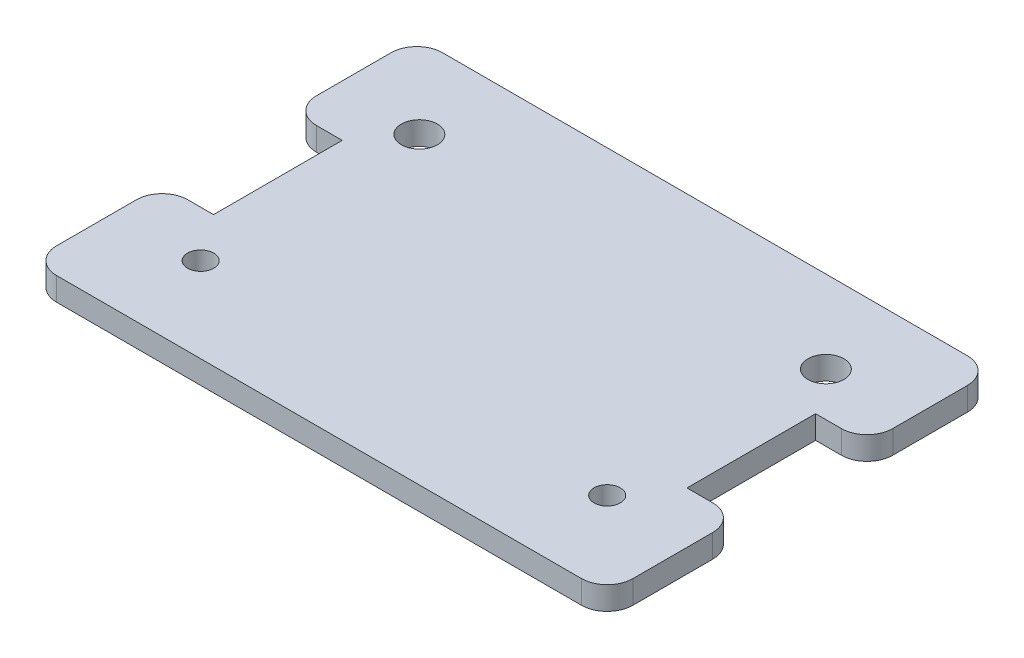
ISO-10303-21;
HEADER;
FILE_DESCRIPTION(('STEP AP214'),'2;1');
FILE_NAME('part.step','',(''),(''),'','','');
FILE_SCHEMA(('AUTOMOTIVE_DESIGN { 1 0 10303 214 1 1 1 1 }'));
ENDSEC;
DATA;
#1=APPLICATION_CONTEXT('core data for automotive mechanical design processes');
#2=APPLICATION_PROTOCOL_DEFINITION('international standard','automotive_design',2000,#1);
#3=PRODUCT_CONTEXT('',#1,'mechanical');
#4=PRODUCT('Part','Part','',(#3));
#5=PRODUCT_RELATED_PRODUCT_CATEGORY('part','',(#4));
#6=PRODUCT_DEFINITION_FORMATION('','',#4);
#7=PRODUCT_DEFINITION_CONTEXT('part definition',#1,'design');
#8=PRODUCT_DEFINITION('design','',#6,#7);
#9=PRODUCT_DEFINITION_SHAPE('','',#8);
#10=(LENGTH_UNIT() NAMED_UNIT(*) SI_UNIT(.MILLI.,.METRE.));
#11=(NAMED_UNIT(*) PLANE_ANGLE_UNIT() SI_UNIT($,.RADIAN.));
#12=(NAMED_UNIT(*) SI_UNIT($,.STERADIAN.) SOLID_ANGLE_UNIT());
#13=UNCERTAINTY_MEASURE_WITH_UNIT(LENGTH_MEASURE(1.E-05),#10,'distance_accuracy_value','');
#14=(GEOMETRIC_REPRESENTATION_CONTEXT(3) GLOBAL_UNCERTAINTY_ASSIGNED_CONTEXT((#13)) GLOBAL_UNIT_ASSIGNED_CONTEXT((#10,
#11,#12)) REPRESENTATION_CONTEXT('',''));
#15=CARTESIAN_POINT('',(0.,0.,0.));
#16=DIRECTION('',(0.,0.,1.));
#17=DIRECTION('',(1.,0.,0.));
#18=AXIS2_PLACEMENT_3D('',#15,#16,#17);
#19=CARTESIAN_POINT('',(0.,4.5,0.));
#20=DIRECTION('',(1.,0.,0.));
#21=DIRECTION('',(0.,0.,-1.));
#22=AXIS2_PLACEMENT_3D('',#19,#20,#21);
#23=PLANE('',#22);
#24=DIRECTION('',(0.,0.,1.));
#25=VECTOR('',#24,1.);
#26=CARTESIAN_POINT('',(0.,0.,0.));
#27=LINE('',#26,#25);
#28=CARTESIAN_POINT('',(0.,0.,-70.));
#29=VERTEX_POINT('',#28);
#30=CARTESIAN_POINT('',(0.,0.,-55.5));
#31=VERTEX_POINT('',#30);
#32=EDGE_CURVE('E262',#29,#31,#27,.T.);
#33=ORIENTED_EDGE('',*,*,#32,.T.);
#34=DIRECTION('',(0.,1.,0.));
#35=VECTOR('',#34,1.);
#36=CARTESIAN_POINT('',(0.,4.5,-55.5));
#37=LINE('',#36,#35);
#38=CARTESIAN_POINT('',(0.,4.5,-55.5));
#39=VERTEX_POINT('',#38);
#40=EDGE_CURVE('E40',#31,#39,#37,.T.);
#41=ORIENTED_EDGE('',*,*,#40,.T.);
#42=DIRECTION('',(0.,0.,1.));
#43=VECTOR('',#42,1.);
#44=CARTESIAN_POINT('',(0.,4.5,0.));
#45=LINE('',#44,#43);
#46=CARTESIAN_POINT('',(0.,4.5,-70.));
#47=VERTEX_POINT('',#46);
#48=EDGE_CURVE('E249',#47,#39,#45,.T.);
#49=ORIENTED_EDGE('',*,*,#48,.F.);
#50=DIRECTION('',(0.,-1.,0.));
#51=VECTOR('',#50,1.);
#52=CARTESIAN_POINT('',(0.,4.5,-70.));
#53=LINE('',#52,#51);
#54=EDGE_CURVE('E335',#47,#29,#53,.T.);
#55=ORIENTED_EDGE('',*,*,#54,.T.);
#56=EDGE_LOOP('',(#33,#41,#49,#55));
#57=FACE_BOUND('',#56,.T.);
#58=ADVANCED_FACE('F32',(#57),#23,.F.);
#59=CARTESIAN_POINT('',(112.,4.5,0.));
#60=DIRECTION('',(-1.,0.,0.));
#61=DIRECTION('',(0.,0.,1.));
#62=AXIS2_PLACEMENT_3D('',#59,#60,#61);
#63=PLANE('',#62);
#64=DIRECTION('',(0.,0.,-1.));
#65=VECTOR('',#64,1.);
#66=CARTESIAN_POINT('',(112.,4.5,0.));
#67=LINE('',#66,#65);
#68=CARTESIAN_POINT('',(112.,4.5,-5.));
#69=VERTEX_POINT('',#68);
#70=CARTESIAN_POINT('',(112.,4.5,-20.5));
#71=VERTEX_POINT('',#70);
#72=EDGE_CURVE('E257',#69,#71,#67,.T.);
#73=ORIENTED_EDGE('',*,*,#72,.F.);
#74=DIRECTION('',(0.,-1.,0.));
#75=VECTOR('',#74,1.);
#76=CARTESIAN_POINT('',(112.,4.5,-5.));
#77=LINE('',#76,#75);
#78=CARTESIAN_POINT('',(112.,0.,-5.));
#79=VERTEX_POINT('',#78);
#80=EDGE_CURVE('E276',#69,#79,#77,.T.);
#81=ORIENTED_EDGE('',*,*,#80,.T.);
#82=DIRECTION('',(0.,0.,-1.));
#83=VECTOR('',#82,1.);
#84=CARTESIAN_POINT('',(112.,0.,0.));
#85=LINE('',#84,#83);
#86=CARTESIAN_POINT('',(112.,0.,-20.5));
#87=VERTEX_POINT('',#86);
#88=EDGE_CURVE('E271',#79,#87,#85,.T.);
#89=ORIENTED_EDGE('',*,*,#88,.T.);
#90=DIRECTION('',(0.,1.,0.));
#91=VECTOR('',#90,1.);
#92=CARTESIAN_POINT('',(112.,4.5,-20.5));
#93=LINE('',#92,#91);
#94=EDGE_CURVE('E261',#87,#71,#93,.T.);
#95=ORIENTED_EDGE('',*,*,#94,.T.);
#96=EDGE_LOOP('',(#73,#81,#89,#95));
#97=FACE_BOUND('',#96,.T.);
#98=ADVANCED_FACE('F362',(#97),#63,.F.);
#99=CARTESIAN_POINT('',(0.,0.,-20.5));
#100=VERTEX_POINT('',#99);
#101=CARTESIAN_POINT('',(0.,0.,-5.));
#102=VERTEX_POINT('',#101);
#103=EDGE_CURVE('E244',#100,#102,#27,.T.);
#104=ORIENTED_EDGE('',*,*,#103,.T.);
#105=DIRECTION('',(0.,-1.,0.));
#106=VECTOR('',#105,1.);
#107=CARTESIAN_POINT('',(0.,4.5,-5.));
#108=LINE('',#107,#106);
#109=CARTESIAN_POINT('',(0.,4.5,-5.));
#110=VERTEX_POINT('',#109);
#111=EDGE_CURVE('E47',#102,#110,#108,.F.);
#112=ORIENTED_EDGE('',*,*,#111,.T.);
#113=CARTESIAN_POINT('',(0.,4.5,-20.5));
#114=VERTEX_POINT('',#113);
#115=EDGE_CURVE('E247',#114,#110,#45,.T.);
#116=ORIENTED_EDGE('',*,*,#115,.F.);
#117=DIRECTION('',(0.,1.,0.));
#118=VECTOR('',#117,1.);
#119=CARTESIAN_POINT('',(0.,4.5,-20.5));
#120=LINE('',#119,#118);
#121=EDGE_CURVE('E329',#114,#100,#120,.F.);
#122=ORIENTED_EDGE('',*,*,#121,.T.);
#123=EDGE_LOOP('',(#104,#112,#116,#122));
#124=FACE_BOUND('',#123,.T.);
#125=ADVANCED_FACE('F364',(#124),#23,.F.);
#126=CARTESIAN_POINT('',(0.,4.5,0.));
#127=DIRECTION('',(0.,0.,-1.));
#128=DIRECTION('',(-1.,0.,0.));
#129=AXIS2_PLACEMENT_3D('',#126,#127,#128);
#130=PLANE('',#129);
#131=DIRECTION('',(1.,0.,0.));
#132=VECTOR('',#131,1.);
#133=CARTESIAN_POINT('',(0.,0.,0.));
#134=LINE('',#133,#132);
#135=CARTESIAN_POINT('',(5.,0.,0.));
#136=VERTEX_POINT('',#135);
#137=CARTESIAN_POINT('',(107.,0.,0.));
#138=VERTEX_POINT('',#137);
#139=EDGE_CURVE('E265',#136,#138,#134,.T.);
#140=ORIENTED_EDGE('',*,*,#139,.T.);
#141=DIRECTION('',(0.,-1.,0.));
#142=VECTOR('',#141,1.);
#143=CARTESIAN_POINT('',(107.,4.5,0.));
#144=LINE('',#143,#142);
#145=CARTESIAN_POINT('',(107.,4.5,0.));
#146=VERTEX_POINT('',#145);
#147=EDGE_CURVE('E298',#138,#146,#144,.F.);
#148=ORIENTED_EDGE('',*,*,#147,.T.);
#149=DIRECTION('',(1.,0.,0.));
#150=VECTOR('',#149,1.);
#151=CARTESIAN_POINT('',(0.,4.5,0.));
#152=LINE('',#151,#150);
#153=CARTESIAN_POINT('',(5.,4.5,0.));
#154=VERTEX_POINT('',#153);
#155=EDGE_CURVE('E251',#154,#146,#152,.T.);
#156=ORIENTED_EDGE('',*,*,#155,.F.);
#157=DIRECTION('',(0.,-1.,0.));
#158=VECTOR('',#157,1.);
#159=CARTESIAN_POINT('',(5.,4.5,0.));
#160=LINE('',#159,#158);
#161=EDGE_CURVE('E295',#154,#136,#160,.T.);
#162=ORIENTED_EDGE('',*,*,#161,.T.);
#163=EDGE_LOOP('',(#140,#148,#156,#162));
#164=FACE_BOUND('',#163,.T.);
#165=ADVANCED_FACE('F375',(#164),#130,.F.);
#166=CARTESIAN_POINT('',(112.,4.5,-55.5));
#167=VERTEX_POINT('',#166);
#168=CARTESIAN_POINT('',(112.,4.5,-70.));
#169=VERTEX_POINT('',#168);
#170=EDGE_CURVE('E254',#167,#169,#67,.T.);
#171=ORIENTED_EDGE('',*,*,#170,.F.);
#172=DIRECTION('',(0.,1.,0.));
#173=VECTOR('',#172,1.);
#174=CARTESIAN_POINT('',(112.,4.5,-55.5));
#175=LINE('',#174,#173);
#176=CARTESIAN_POINT('',(112.,0.,-55.5));
#177=VERTEX_POINT('',#176);
#178=EDGE_CURVE('E322',#167,#177,#175,.F.);
#179=ORIENTED_EDGE('',*,*,#178,.T.);
#180=CARTESIAN_POINT('',(112.,0.,-70.));
#181=VERTEX_POINT('',#180);
#182=EDGE_CURVE('E268',#177,#181,#85,.T.);
#183=ORIENTED_EDGE('',*,*,#182,.T.);
#184=DIRECTION('',(0.,-1.,0.));
#185=VECTOR('',#184,1.);
#186=CARTESIAN_POINT('',(112.,4.5,-70.));
#187=LINE('',#186,#185);
#188=EDGE_CURVE('E320',#181,#169,#187,.F.);
#189=ORIENTED_EDGE('',*,*,#188,.T.);
#190=EDGE_LOOP('',(#171,#179,#183,#189));
#191=FACE_BOUND('',#190,.T.);
#192=ADVANCED_FACE('F371',(#191),#63,.F.);
#193=CARTESIAN_POINT('',(0.,4.5,-75.));
#194=DIRECTION('',(0.,0.,1.));
#195=DIRECTION('',(1.,0.,0.));
#196=AXIS2_PLACEMENT_3D('',#193,#194,#195);
#197=PLANE('',#196);
#198=DIRECTION('',(-1.,0.,0.));
#199=VECTOR('',#198,1.);
#200=CARTESIAN_POINT('',(0.,4.5,-75.));
#201=LINE('',#200,#199);
#202=CARTESIAN_POINT('',(107.,4.5,-75.));
#203=VERTEX_POINT('',#202);
#204=CARTESIAN_POINT('',(5.,4.5,-75.));
#205=VERTEX_POINT('',#204);
#206=EDGE_CURVE('E258',#203,#205,#201,.T.);
#207=ORIENTED_EDGE('',*,*,#206,.F.);
#208=DIRECTION('',(0.,-1.,0.));
#209=VECTOR('',#208,1.);
#210=CARTESIAN_POINT('',(107.,4.5,-75.));
#211=LINE('',#210,#209);
#212=CARTESIAN_POINT('',(107.,0.,-75.));
#213=VERTEX_POINT('',#212);
#214=EDGE_CURVE('E326',#203,#213,#211,.T.);
#215=ORIENTED_EDGE('',*,*,#214,.T.);
#216=DIRECTION('',(-1.,0.,0.));
#217=VECTOR('',#216,1.);
#218=CARTESIAN_POINT('',(0.,0.,-75.));
#219=LINE('',#218,#217);
#220=CARTESIAN_POINT('',(5.,0.,-75.));
#221=VERTEX_POINT('',#220);
#222=EDGE_CURVE('E250',#213,#221,#219,.T.);
#223=ORIENTED_EDGE('',*,*,#222,.T.);
#224=DIRECTION('',(0.,-1.,0.));
#225=VECTOR('',#224,1.);
#226=CARTESIAN_POINT('',(5.,4.5,-75.));
#227=LINE('',#226,#225);
#228=EDGE_CURVE('E324',#221,#205,#227,.F.);
#229=ORIENTED_EDGE('',*,*,#228,.T.);
#230=EDGE_LOOP('',(#207,#215,#223,#229));
#231=FACE_BOUND('',#230,.T.);
#232=ADVANCED_FACE('F428',(#231),#197,.F.);
#233=CARTESIAN_POINT('',(0.,4.5,0.));
#234=DIRECTION('',(0.,-1.,0.));
#235=DIRECTION('',(0.,0.,-1.));
#236=AXIS2_PLACEMENT_3D('',#233,#234,#235);
#237=PLANE('',#236);
#238=CARTESIAN_POINT('',(16.5,4.5,-16.5));
#239=DIRECTION('',(0.,1.,0.));
#240=DIRECTION('',(0.,0.,1.));
#241=AXIS2_PLACEMENT_3D('',#238,#239,#240);
#242=CIRCLE('',#241,2.55);
#243=CARTESIAN_POINT('',(16.5,4.5,-13.95));
#244=VERTEX_POINT('',#243);
#245=EDGE_CURVE('E211',#244,#244,#242,.T.);
#246=ORIENTED_EDGE('',*,*,#245,.F.);
#247=EDGE_LOOP('',(#246));
#248=FACE_BOUND('',#247,.T.);
#249=CARTESIAN_POINT('',(16.5,4.5,-59.));
#250=DIRECTION('',(0.,1.,0.));
#251=DIRECTION('',(0.,0.,1.));
#252=AXIS2_PLACEMENT_3D('',#249,#250,#251);
#253=CIRCLE('',#252,3.5);
#254=CARTESIAN_POINT('',(16.5,4.5,-55.5));
#255=VERTEX_POINT('',#254);
#256=EDGE_CURVE('E217',#255,#255,#253,.T.);
#257=ORIENTED_EDGE('',*,*,#256,.F.);
#258=EDGE_LOOP('',(#257));
#259=FACE_BOUND('',#258,.T.);
#260=CARTESIAN_POINT('',(95.5,4.5,-59.));
#261=DIRECTION('',(0.,1.,0.));
#262=DIRECTION('',(0.,0.,1.));
#263=AXIS2_PLACEMENT_3D('',#260,#261,#262);
#264=CIRCLE('',#263,3.50000000000001);
#265=CARTESIAN_POINT('',(95.5,4.5,-55.5));
#266=VERTEX_POINT('',#265);
#267=EDGE_CURVE('E181',#266,#266,#264,.T.);
#268=ORIENTED_EDGE('',*,*,#267,.F.);
#269=EDGE_LOOP('',(#268));
#270=FACE_BOUND('',#269,.T.);
#271=CARTESIAN_POINT('',(95.5,4.5,-16.5));
#272=DIRECTION('',(0.,1.,0.));
#273=DIRECTION('',(0.,0.,1.));
#274=AXIS2_PLACEMENT_3D('',#271,#272,#273);
#275=CIRCLE('',#274,2.54999999999999);
#276=CARTESIAN_POINT('',(95.5,4.5,-13.95));
#277=VERTEX_POINT('',#276);
#278=EDGE_CURVE('E210',#277,#277,#275,.T.);
#279=ORIENTED_EDGE('',*,*,#278,.F.);
#280=EDGE_LOOP('',(#279));
#281=FACE_BOUND('',#280,.T.);
#282=ORIENTED_EDGE('',*,*,#155,.T.);
#283=CARTESIAN_POINT('',(107.,4.5,-5.));
#284=DIRECTION('',(0.,-1.,0.));
#285=DIRECTION('',(0.,0.,-1.));
#286=AXIS2_PLACEMENT_3D('',#283,#284,#285);
#287=CIRCLE('',#286,5.);
#288=EDGE_CURVE('E313',#146,#69,#287,.F.);
#289=ORIENTED_EDGE('',*,*,#288,.T.);
#290=ORIENTED_EDGE('',*,*,#72,.T.);
#291=CARTESIAN_POINT('',(107.,4.5,-20.5));
#292=DIRECTION('',(0.,-1.,0.));
#293=DIRECTION('',(0.,0.,-1.));
#294=AXIS2_PLACEMENT_3D('',#291,#292,#293);
#295=CIRCLE('',#294,5.);
#296=CARTESIAN_POINT('',(107.,4.5,-25.5));
#297=VERTEX_POINT('',#296);
#298=EDGE_CURVE('E311',#71,#297,#295,.F.);
#299=ORIENTED_EDGE('',*,*,#298,.T.);
#300=DIRECTION('',(1.,0.,0.));
#301=VECTOR('',#300,1.);
#302=CARTESIAN_POINT('',(112.,4.5,-25.5));
#303=LINE('',#302,#301);
#304=CARTESIAN_POINT('',(102.,4.5,-25.5));
#305=VERTEX_POINT('',#304);
#306=EDGE_CURVE('E224',#305,#297,#303,.T.);
#307=ORIENTED_EDGE('',*,*,#306,.F.);
#308=DIRECTION('',(0.,0.,1.));
#309=VECTOR('',#308,1.);
#310=CARTESIAN_POINT('',(102.,4.5,-25.5));
#311=LINE('',#310,#309);
#312=CARTESIAN_POINT('',(102.,4.5,-50.5));
#313=VERTEX_POINT('',#312);
#314=EDGE_CURVE('E233',#313,#305,#311,.T.);
#315=ORIENTED_EDGE('',*,*,#314,.F.);
#316=DIRECTION('',(-1.,0.,0.));
#317=VECTOR('',#316,1.);
#318=CARTESIAN_POINT('',(112.,4.5,-50.5));
#319=LINE('',#318,#317);
#320=CARTESIAN_POINT('',(107.,4.5,-50.5));
#321=VERTEX_POINT('',#320);
#322=EDGE_CURVE('E231',#321,#313,#319,.T.);
#323=ORIENTED_EDGE('',*,*,#322,.F.);
#324=CARTESIAN_POINT('',(107.,4.5,-55.5));
#325=DIRECTION('',(0.,-1.,0.));
#326=DIRECTION('',(0.,0.,-1.));
#327=AXIS2_PLACEMENT_3D('',#324,#325,#326);
#328=CIRCLE('',#327,5.);
#329=EDGE_CURVE('E309',#321,#167,#328,.F.);
#330=ORIENTED_EDGE('',*,*,#329,.T.);
#331=ORIENTED_EDGE('',*,*,#170,.T.);
#332=CARTESIAN_POINT('',(107.,4.5,-70.));
#333=DIRECTION('',(0.,-1.,0.));
#334=DIRECTION('',(0.,0.,-1.));
#335=AXIS2_PLACEMENT_3D('',#332,#333,#334);
#336=CIRCLE('',#335,5.);
#337=EDGE_CURVE('E307',#169,#203,#336,.F.);
#338=ORIENTED_EDGE('',*,*,#337,.T.);
#339=ORIENTED_EDGE('',*,*,#206,.T.);
#340=CARTESIAN_POINT('',(5.,4.5,-70.));
#341=DIRECTION('',(0.,-1.,0.));
#342=DIRECTION('',(0.,0.,-1.));
#343=AXIS2_PLACEMENT_3D('',#340,#341,#342);
#344=CIRCLE('',#343,5.);
#345=EDGE_CURVE('E300',#205,#47,#344,.F.);
#346=ORIENTED_EDGE('',*,*,#345,.T.);
#347=ORIENTED_EDGE('',*,*,#48,.T.);
#348=CARTESIAN_POINT('',(5.,4.5,-55.5));
#349=DIRECTION('',(0.,-1.,0.));
#350=DIRECTION('',(0.,0.,-1.));
#351=AXIS2_PLACEMENT_3D('',#348,#349,#350);
#352=CIRCLE('',#351,5.);
#353=CARTESIAN_POINT('',(5.,4.5,-50.5));
#354=VERTEX_POINT('',#353);
#355=EDGE_CURVE('E302',#39,#354,#352,.F.);
#356=ORIENTED_EDGE('',*,*,#355,.T.);
#357=DIRECTION('',(-1.,0.,0.));
#358=VECTOR('',#357,1.);
#359=CARTESIAN_POINT('',(0.,4.5,-50.5));
#360=LINE('',#359,#358);
#361=CARTESIAN_POINT('',(10.,4.5,-50.5));
#362=VERTEX_POINT('',#361);
#363=EDGE_CURVE('E197',#362,#354,#360,.T.);
#364=ORIENTED_EDGE('',*,*,#363,.F.);
#365=DIRECTION('',(0.,0.,-1.));
#366=VECTOR('',#365,1.);
#367=CARTESIAN_POINT('',(10.,4.5,-25.5));
#368=LINE('',#367,#366);
#369=CARTESIAN_POINT('',(10.,4.5,-25.5));
#370=VERTEX_POINT('',#369);
#371=EDGE_CURVE('E177',#370,#362,#368,.T.);
#372=ORIENTED_EDGE('',*,*,#371,.F.);
#373=DIRECTION('',(1.,0.,0.));
#374=VECTOR('',#373,1.);
#375=CARTESIAN_POINT('',(0.,4.5,-25.5));
#376=LINE('',#375,#374);
#377=CARTESIAN_POINT('',(5.,4.5,-25.5));
#378=VERTEX_POINT('',#377);
#379=EDGE_CURVE('E201',#378,#370,#376,.T.);
#380=ORIENTED_EDGE('',*,*,#379,.F.);
#381=CARTESIAN_POINT('',(5.,4.5,-20.5));
#382=DIRECTION('',(0.,-1.,0.));
#383=DIRECTION('',(0.,0.,-1.));
#384=AXIS2_PLACEMENT_3D('',#381,#382,#383);
#385=CIRCLE('',#384,5.);
#386=EDGE_CURVE('E54',#378,#114,#385,.F.);
#387=ORIENTED_EDGE('',*,*,#386,.T.);
#388=ORIENTED_EDGE('',*,*,#115,.T.);
#389=CARTESIAN_POINT('',(5.,4.5,-5.));
#390=DIRECTION('',(0.,-1.,0.));
#391=DIRECTION('',(0.,0.,-1.));
#392=AXIS2_PLACEMENT_3D('',#389,#390,#391);
#393=CIRCLE('',#392,5.);
#394=EDGE_CURVE('E305',#110,#154,#393,.F.);
#395=ORIENTED_EDGE('',*,*,#394,.T.);
#396=EDGE_LOOP('',(#282,#289,#290,#299,#307,#315,#323,#330,#331,#338,#339,#346,#347,#356,#364,
#372,#380,#387,#388,#395));
#397=FACE_BOUND('',#396,.T.);
#398=ADVANCED_FACE('F345',(#248,#259,#270,#281,#397),#237,.F.);
#399=CARTESIAN_POINT('',(0.,0.,0.));
#400=DIRECTION('',(0.,-1.,0.));
#401=DIRECTION('',(0.,0.,-1.));
#402=AXIS2_PLACEMENT_3D('',#399,#400,#401);
#403=PLANE('',#402);
#404=ORIENTED_EDGE('',*,*,#88,.F.);
#405=CARTESIAN_POINT('',(107.,0.,-5.));
#406=DIRECTION('',(0.,-1.,0.));
#407=DIRECTION('',(0.,0.,-1.));
#408=AXIS2_PLACEMENT_3D('',#405,#406,#407);
#409=CIRCLE('',#408,5.);
#410=EDGE_CURVE('E293',#79,#138,#409,.T.);
#411=ORIENTED_EDGE('',*,*,#410,.T.);
#412=ORIENTED_EDGE('',*,*,#139,.F.);
#413=CARTESIAN_POINT('',(5.,0.,-5.));
#414=DIRECTION('',(0.,-1.,0.));
#415=DIRECTION('',(0.,0.,-1.));
#416=AXIS2_PLACEMENT_3D('',#413,#414,#415);
#417=CIRCLE('',#416,5.);
#418=EDGE_CURVE('E285',#136,#102,#417,.T.);
#419=ORIENTED_EDGE('',*,*,#418,.T.);
#420=ORIENTED_EDGE('',*,*,#103,.F.);
#421=CARTESIAN_POINT('',(5.,0.,-20.5));
#422=DIRECTION('',(0.,-1.,0.));
#423=DIRECTION('',(0.,0.,-1.));
#424=AXIS2_PLACEMENT_3D('',#421,#422,#423);
#425=CIRCLE('',#424,5.);
#426=CARTESIAN_POINT('',(5.,0.,-25.5));
#427=VERTEX_POINT('',#426);
#428=EDGE_CURVE('E283',#100,#427,#425,.T.);
#429=ORIENTED_EDGE('',*,*,#428,.T.);
#430=DIRECTION('',(1.,0.,0.));
#431=VECTOR('',#430,1.);
#432=CARTESIAN_POINT('',(0.,0.,-25.5));
#433=LINE('',#432,#431);
#434=CARTESIAN_POINT('',(10.,0.,-25.5));
#435=VERTEX_POINT('',#434);
#436=EDGE_CURVE('E195',#427,#435,#433,.T.);
#437=ORIENTED_EDGE('',*,*,#436,.T.);
#438=DIRECTION('',(0.,0.,-1.));
#439=VECTOR('',#438,1.);
#440=CARTESIAN_POINT('',(10.,0.,-25.5));
#441=LINE('',#440,#439);
#442=CARTESIAN_POINT('',(10.,0.,-50.5));
#443=VERTEX_POINT('',#442);
#444=EDGE_CURVE('E174',#435,#443,#441,.T.);
#445=ORIENTED_EDGE('',*,*,#444,.T.);
#446=DIRECTION('',(-1.,0.,0.));
#447=VECTOR('',#446,1.);
#448=CARTESIAN_POINT('',(0.,0.,-50.5));
#449=LINE('',#448,#447);
#450=CARTESIAN_POINT('',(5.,0.,-50.5));
#451=VERTEX_POINT('',#450);
#452=EDGE_CURVE('E185',#443,#451,#449,.T.);
#453=ORIENTED_EDGE('',*,*,#452,.T.);
#454=CARTESIAN_POINT('',(5.,0.,-55.5));
#455=DIRECTION('',(0.,-1.,0.));
#456=DIRECTION('',(0.,0.,-1.));
#457=AXIS2_PLACEMENT_3D('',#454,#455,#456);
#458=CIRCLE('',#457,5.);
#459=EDGE_CURVE('E281',#451,#31,#458,.T.);
#460=ORIENTED_EDGE('',*,*,#459,.T.);
#461=ORIENTED_EDGE('',*,*,#32,.F.);
#462=CARTESIAN_POINT('',(5.,0.,-70.));
#463=DIRECTION('',(0.,-1.,0.));
#464=DIRECTION('',(0.,0.,-1.));
#465=AXIS2_PLACEMENT_3D('',#462,#463,#464);
#466=CIRCLE('',#465,5.);
#467=EDGE_CURVE('E279',#29,#221,#466,.T.);
#468=ORIENTED_EDGE('',*,*,#467,.T.);
#469=ORIENTED_EDGE('',*,*,#222,.F.);
#470=CARTESIAN_POINT('',(107.,0.,-70.));
#471=DIRECTION('',(0.,-1.,0.));
#472=DIRECTION('',(0.,0.,-1.));
#473=AXIS2_PLACEMENT_3D('',#470,#471,#472);
#474=CIRCLE('',#473,5.);
#475=EDGE_CURVE('E287',#213,#181,#474,.T.);
#476=ORIENTED_EDGE('',*,*,#475,.T.);
#477=ORIENTED_EDGE('',*,*,#182,.F.);
#478=CARTESIAN_POINT('',(107.,0.,-55.5));
#479=DIRECTION('',(0.,-1.,0.));
#480=DIRECTION('',(0.,0.,-1.));
#481=AXIS2_PLACEMENT_3D('',#478,#479,#480);
#482=CIRCLE('',#481,5.);
#483=CARTESIAN_POINT('',(107.,0.,-50.5));
#484=VERTEX_POINT('',#483);
#485=EDGE_CURVE('E289',#177,#484,#482,.T.);
#486=ORIENTED_EDGE('',*,*,#485,.T.);
#487=DIRECTION('',(-1.,0.,0.));
#488=VECTOR('',#487,1.);
#489=CARTESIAN_POINT('',(112.,0.,-50.5));
#490=LINE('',#489,#488);
#491=CARTESIAN_POINT('',(102.,0.,-50.5));
#492=VERTEX_POINT('',#491);
#493=EDGE_CURVE('E221',#484,#492,#490,.T.);
#494=ORIENTED_EDGE('',*,*,#493,.T.);
#495=DIRECTION('',(0.,0.,1.));
#496=VECTOR('',#495,1.);
#497=CARTESIAN_POINT('',(102.,0.,-25.5));
#498=LINE('',#497,#496);
#499=CARTESIAN_POINT('',(102.,0.,-25.5));
#500=VERTEX_POINT('',#499);
#501=EDGE_CURVE('E223',#492,#500,#498,.T.);
#502=ORIENTED_EDGE('',*,*,#501,.T.);
#503=DIRECTION('',(1.,0.,0.));
#504=VECTOR('',#503,1.);
#505=CARTESIAN_POINT('',(112.,0.,-25.5));
#506=LINE('',#505,#504);
#507=CARTESIAN_POINT('',(107.,0.,-25.5));
#508=VERTEX_POINT('',#507);
#509=EDGE_CURVE('E227',#500,#508,#506,.T.);
#510=ORIENTED_EDGE('',*,*,#509,.T.);
#511=CARTESIAN_POINT('',(107.,0.,-20.5));
#512=DIRECTION('',(0.,-1.,0.));
#513=DIRECTION('',(0.,0.,-1.));
#514=AXIS2_PLACEMENT_3D('',#511,#512,#513);
#515=CIRCLE('',#514,5.);
#516=EDGE_CURVE('E291',#508,#87,#515,.T.);
#517=ORIENTED_EDGE('',*,*,#516,.T.);
#518=EDGE_LOOP('',(#404,#411,#412,#419,#420,#429,#437,#445,#453,#460,#461,#468,#469,#476,#477,
#486,#494,#502,#510,#517));
#519=FACE_BOUND('',#518,.T.);
#520=CARTESIAN_POINT('',(16.5,0.,-16.5));
#521=DIRECTION('',(0.,1.,0.));
#522=DIRECTION('',(0.,0.,1.));
#523=AXIS2_PLACEMENT_3D('',#520,#521,#522);
#524=CIRCLE('',#523,2.55);
#525=CARTESIAN_POINT('',(16.5,0.,-13.95));
#526=VERTEX_POINT('',#525);
#527=EDGE_CURVE('E207',#526,#526,#524,.T.);
#528=ORIENTED_EDGE('',*,*,#527,.T.);
#529=EDGE_LOOP('',(#528));
#530=FACE_BOUND('',#529,.T.);
#531=CARTESIAN_POINT('',(16.5,0.,-59.));
#532=DIRECTION('',(0.,1.,0.));
#533=DIRECTION('',(0.,0.,1.));
#534=AXIS2_PLACEMENT_3D('',#531,#532,#533);
#535=CIRCLE('',#534,3.5);
#536=CARTESIAN_POINT('',(16.5,0.,-55.5));
#537=VERTEX_POINT('',#536);
#538=EDGE_CURVE('E214',#537,#537,#535,.T.);
#539=ORIENTED_EDGE('',*,*,#538,.T.);
#540=EDGE_LOOP('',(#539));
#541=FACE_BOUND('',#540,.T.);
#542=CARTESIAN_POINT('',(95.5,0.,-59.));
#543=DIRECTION('',(0.,1.,0.));
#544=DIRECTION('',(0.,0.,1.));
#545=AXIS2_PLACEMENT_3D('',#542,#543,#544);
#546=CIRCLE('',#545,3.50000000000001);
#547=CARTESIAN_POINT('',(95.5,0.,-55.5));
#548=VERTEX_POINT('',#547);
#549=EDGE_CURVE('E220',#548,#548,#546,.T.);
#550=ORIENTED_EDGE('',*,*,#549,.T.);
#551=EDGE_LOOP('',(#550));
#552=FACE_BOUND('',#551,.T.);
#553=CARTESIAN_POINT('',(95.5,0.,-16.5));
#554=DIRECTION('',(0.,1.,0.));
#555=DIRECTION('',(0.,0.,1.));
#556=AXIS2_PLACEMENT_3D('',#553,#554,#555);
#557=CIRCLE('',#556,2.54999999999999);
#558=CARTESIAN_POINT('',(95.5,0.,-13.95));
#559=VERTEX_POINT('',#558);
#560=EDGE_CURVE('E241',#559,#559,#557,.T.);
#561=ORIENTED_EDGE('',*,*,#560,.T.);
#562=EDGE_LOOP('',(#561));
#563=FACE_BOUND('',#562,.T.);
#564=ADVANCED_FACE('F192',(#519,#530,#541,#552,#563),#403,.T.);
#565=CARTESIAN_POINT('',(95.5,0.,-16.5));
#566=DIRECTION('',(0.,1.,0.));
#567=DIRECTION('',(0.,0.,1.));
#568=AXIS2_PLACEMENT_3D('',#565,#566,#567);
#569=CYLINDRICAL_SURFACE('',#568,2.54999999999999);
#570=ORIENTED_EDGE('',*,*,#560,.F.);
#571=EDGE_LOOP('',(#570));
#572=FACE_BOUND('',#571,.T.);
#573=ORIENTED_EDGE('',*,*,#278,.T.);
#574=EDGE_LOOP('',(#573));
#575=FACE_BOUND('',#574,.T.);
#576=ADVANCED_FACE('F439',(#572,#575),#569,.F.);
#577=CARTESIAN_POINT('',(0.,0.,-50.5));
#578=DIRECTION('',(0.,0.,-1.));
#579=DIRECTION('',(-1.,0.,0.));
#580=AXIS2_PLACEMENT_3D('',#577,#578,#579);
#581=PLANE('',#580);
#582=ORIENTED_EDGE('',*,*,#363,.T.);
#583=DIRECTION('',(0.,1.,0.));
#584=VECTOR('',#583,1.);
#585=CARTESIAN_POINT('',(5.,0.,-50.5));
#586=LINE('',#585,#584);
#587=EDGE_CURVE('E11',#354,#451,#586,.F.);
#588=ORIENTED_EDGE('',*,*,#587,.T.);
#589=ORIENTED_EDGE('',*,*,#452,.F.);
#590=DIRECTION('',(0.,1.,0.));
#591=VECTOR('',#590,1.);
#592=CARTESIAN_POINT('',(10.,0.,-50.5));
#593=LINE('',#592,#591);
#594=EDGE_CURVE('E169',#443,#362,#593,.T.);
#595=ORIENTED_EDGE('',*,*,#594,.T.);
#596=EDGE_LOOP('',(#582,#588,#589,#595));
#597=FACE_BOUND('',#596,.T.);
#598=ADVANCED_FACE('F186',(#597),#581,.F.);
#599=CARTESIAN_POINT('',(10.,0.,-25.5));
#600=DIRECTION('',(1.,0.,0.));
#601=DIRECTION('',(0.,0.,-1.));
#602=AXIS2_PLACEMENT_3D('',#599,#600,#601);
#603=PLANE('',#602);
#604=ORIENTED_EDGE('',*,*,#371,.T.);
#605=ORIENTED_EDGE('',*,*,#594,.F.);
#606=ORIENTED_EDGE('',*,*,#444,.F.);
#607=DIRECTION('',(0.,1.,0.));
#608=VECTOR('',#607,1.);
#609=CARTESIAN_POINT('',(10.,0.,-25.5));
#610=LINE('',#609,#608);
#611=EDGE_CURVE('E182',#435,#370,#610,.T.);
#612=ORIENTED_EDGE('',*,*,#611,.T.);
#613=EDGE_LOOP('',(#604,#605,#606,#612));
#614=FACE_BOUND('',#613,.T.);
#615=ADVANCED_FACE('F171',(#614),#603,.F.);
#616=CARTESIAN_POINT('',(0.,0.,-25.5));
#617=DIRECTION('',(0.,0.,1.));
#618=DIRECTION('',(1.,0.,0.));
#619=AXIS2_PLACEMENT_3D('',#616,#617,#618);
#620=PLANE('',#619);
#621=ORIENTED_EDGE('',*,*,#436,.F.);
#622=DIRECTION('',(0.,1.,0.));
#623=VECTOR('',#622,1.);
#624=CARTESIAN_POINT('',(5.,0.,-25.5));
#625=LINE('',#624,#623);
#626=EDGE_CURVE('E332',#427,#378,#625,.T.);
#627=ORIENTED_EDGE('',*,*,#626,.T.);
#628=ORIENTED_EDGE('',*,*,#379,.T.);
#629=ORIENTED_EDGE('',*,*,#611,.F.);
#630=EDGE_LOOP('',(#621,#627,#628,#629));
#631=FACE_BOUND('',#630,.T.);
#632=ADVANCED_FACE('F459',(#631),#620,.F.);
#633=CARTESIAN_POINT('',(95.5,0.,-59.));
#634=DIRECTION('',(0.,1.,0.));
#635=DIRECTION('',(0.,0.,1.));
#636=AXIS2_PLACEMENT_3D('',#633,#634,#635);
#637=CYLINDRICAL_SURFACE('',#636,3.50000000000001);
#638=ORIENTED_EDGE('',*,*,#549,.F.);
#639=EDGE_LOOP('',(#638));
#640=FACE_BOUND('',#639,.T.);
#641=ORIENTED_EDGE('',*,*,#267,.T.);
#642=EDGE_LOOP('',(#641));
#643=FACE_BOUND('',#642,.T.);
#644=ADVANCED_FACE('F454',(#640,#643),#637,.F.);
#645=CARTESIAN_POINT('',(16.5,0.,-59.));
#646=DIRECTION('',(0.,1.,0.));
#647=DIRECTION('',(0.,0.,1.));
#648=AXIS2_PLACEMENT_3D('',#645,#646,#647);
#649=CYLINDRICAL_SURFACE('',#648,3.5);
#650=ORIENTED_EDGE('',*,*,#538,.F.);
#651=EDGE_LOOP('',(#650));
#652=FACE_BOUND('',#651,.T.);
#653=ORIENTED_EDGE('',*,*,#256,.T.);
#654=EDGE_LOOP('',(#653));
#655=FACE_BOUND('',#654,.T.);
#656=ADVANCED_FACE('F451',(#652,#655),#649,.F.);
#657=CARTESIAN_POINT('',(16.5,0.,-16.5));
#658=DIRECTION('',(0.,1.,0.));
#659=DIRECTION('',(0.,0.,1.));
#660=AXIS2_PLACEMENT_3D('',#657,#658,#659);
#661=CYLINDRICAL_SURFACE('',#660,2.55);
#662=ORIENTED_EDGE('',*,*,#527,.F.);
#663=EDGE_LOOP('',(#662));
#664=FACE_BOUND('',#663,.T.);
#665=ORIENTED_EDGE('',*,*,#245,.T.);
#666=EDGE_LOOP('',(#665));
#667=FACE_BOUND('',#666,.T.);
#668=ADVANCED_FACE('F450',(#664,#667),#661,.F.);
#669=CARTESIAN_POINT('',(112.,0.,-25.5));
#670=DIRECTION('',(0.,0.,1.));
#671=DIRECTION('',(1.,0.,0.));
#672=AXIS2_PLACEMENT_3D('',#669,#670,#671);
#673=PLANE('',#672);
#674=ORIENTED_EDGE('',*,*,#306,.T.);
#675=DIRECTION('',(0.,1.,0.));
#676=VECTOR('',#675,1.);
#677=CARTESIAN_POINT('',(107.,0.,-25.5));
#678=LINE('',#677,#676);
#679=EDGE_CURVE('E315',#297,#508,#678,.F.);
#680=ORIENTED_EDGE('',*,*,#679,.T.);
#681=ORIENTED_EDGE('',*,*,#509,.F.);
#682=DIRECTION('',(0.,1.,0.));
#683=VECTOR('',#682,1.);
#684=CARTESIAN_POINT('',(102.,0.,-25.5));
#685=LINE('',#684,#683);
#686=EDGE_CURVE('E203',#500,#305,#685,.T.);
#687=ORIENTED_EDGE('',*,*,#686,.T.);
#688=EDGE_LOOP('',(#674,#680,#681,#687));
#689=FACE_BOUND('',#688,.T.);
#690=ADVANCED_FACE('F404',(#689),#673,.F.);
#691=CARTESIAN_POINT('',(102.,0.,-25.5));
#692=DIRECTION('',(-1.,0.,0.));
#693=DIRECTION('',(0.,0.,1.));
#694=AXIS2_PLACEMENT_3D('',#691,#692,#693);
#695=PLANE('',#694);
#696=ORIENTED_EDGE('',*,*,#314,.T.);
#697=ORIENTED_EDGE('',*,*,#686,.F.);
#698=ORIENTED_EDGE('',*,*,#501,.F.);
#699=DIRECTION('',(0.,1.,0.));
#700=VECTOR('',#699,1.);
#701=CARTESIAN_POINT('',(102.,0.,-50.5));
#702=LINE('',#701,#700);
#703=EDGE_CURVE('E230',#492,#313,#702,.T.);
#704=ORIENTED_EDGE('',*,*,#703,.T.);
#705=EDGE_LOOP('',(#696,#697,#698,#704));
#706=FACE_BOUND('',#705,.T.);
#707=ADVANCED_FACE('F408',(#706),#695,.F.);
#708=CARTESIAN_POINT('',(112.,0.,-50.5));
#709=DIRECTION('',(0.,0.,-1.));
#710=DIRECTION('',(-1.,0.,0.));
#711=AXIS2_PLACEMENT_3D('',#708,#709,#710);
#712=PLANE('',#711);
#713=ORIENTED_EDGE('',*,*,#493,.F.);
#714=DIRECTION('',(0.,1.,0.));
#715=VECTOR('',#714,1.);
#716=CARTESIAN_POINT('',(107.,0.,-50.5));
#717=LINE('',#716,#715);
#718=EDGE_CURVE('E317',#484,#321,#717,.T.);
#719=ORIENTED_EDGE('',*,*,#718,.T.);
#720=ORIENTED_EDGE('',*,*,#322,.T.);
#721=ORIENTED_EDGE('',*,*,#703,.F.);
#722=EDGE_LOOP('',(#713,#719,#720,#721));
#723=FACE_BOUND('',#722,.T.);
#724=ADVANCED_FACE('F414',(#723),#712,.F.);
#725=CARTESIAN_POINT('',(107.,4.5,-5.));
#726=DIRECTION('',(0.,-1.,0.));
#727=DIRECTION('',(0.,0.,-1.));
#728=AXIS2_PLACEMENT_3D('',#725,#726,#727);
#729=CYLINDRICAL_SURFACE('',#728,5.);
#730=ORIENTED_EDGE('',*,*,#288,.F.);
#731=ORIENTED_EDGE('',*,*,#147,.F.);
#732=ORIENTED_EDGE('',*,*,#410,.F.);
#733=ORIENTED_EDGE('',*,*,#80,.F.);
#734=EDGE_LOOP('',(#730,#731,#732,#733));
#735=FACE_BOUND('',#734,.T.);
#736=ADVANCED_FACE('F391',(#735),#729,.T.);
#737=CARTESIAN_POINT('',(107.,4.5,-20.5));
#738=DIRECTION('',(0.,1.,0.));
#739=DIRECTION('',(0.,0.,1.));
#740=AXIS2_PLACEMENT_3D('',#737,#738,#739);
#741=CYLINDRICAL_SURFACE('',#740,5.);
#742=ORIENTED_EDGE('',*,*,#516,.F.);
#743=ORIENTED_EDGE('',*,*,#679,.F.);
#744=ORIENTED_EDGE('',*,*,#298,.F.);
#745=ORIENTED_EDGE('',*,*,#94,.F.);
#746=EDGE_LOOP('',(#742,#743,#744,#745));
#747=FACE_BOUND('',#746,.T.);
#748=ADVANCED_FACE('F399',(#747),#741,.T.);
#749=CARTESIAN_POINT('',(107.,0.,-55.5));
#750=DIRECTION('',(0.,1.,0.));
#751=DIRECTION('',(0.,0.,1.));
#752=AXIS2_PLACEMENT_3D('',#749,#750,#751);
#753=CYLINDRICAL_SURFACE('',#752,5.);
#754=ORIENTED_EDGE('',*,*,#485,.F.);
#755=ORIENTED_EDGE('',*,*,#178,.F.);
#756=ORIENTED_EDGE('',*,*,#329,.F.);
#757=ORIENTED_EDGE('',*,*,#718,.F.);
#758=EDGE_LOOP('',(#754,#755,#756,#757));
#759=FACE_BOUND('',#758,.T.);
#760=ADVANCED_FACE('F418',(#759),#753,.T.);
#761=CARTESIAN_POINT('',(107.,4.5,-70.));
#762=DIRECTION('',(0.,-1.,0.));
#763=DIRECTION('',(0.,0.,-1.));
#764=AXIS2_PLACEMENT_3D('',#761,#762,#763);
#765=CYLINDRICAL_SURFACE('',#764,5.);
#766=ORIENTED_EDGE('',*,*,#337,.F.);
#767=ORIENTED_EDGE('',*,*,#188,.F.);
#768=ORIENTED_EDGE('',*,*,#475,.F.);
#769=ORIENTED_EDGE('',*,*,#214,.F.);
#770=EDGE_LOOP('',(#766,#767,#768,#769));
#771=FACE_BOUND('',#770,.T.);
#772=ADVANCED_FACE('F426',(#771),#765,.T.);
#773=CARTESIAN_POINT('',(5.,4.5,-5.));
#774=DIRECTION('',(0.,-1.,0.));
#775=DIRECTION('',(0.,0.,-1.));
#776=AXIS2_PLACEMENT_3D('',#773,#774,#775);
#777=CYLINDRICAL_SURFACE('',#776,5.);
#778=ORIENTED_EDGE('',*,*,#394,.F.);
#779=ORIENTED_EDGE('',*,*,#111,.F.);
#780=ORIENTED_EDGE('',*,*,#418,.F.);
#781=ORIENTED_EDGE('',*,*,#161,.F.);
#782=EDGE_LOOP('',(#778,#779,#780,#781));
#783=FACE_BOUND('',#782,.T.);
#784=ADVANCED_FACE('F358',(#783),#777,.T.);
#785=CARTESIAN_POINT('',(5.,0.,-20.5));
#786=DIRECTION('',(0.,1.,0.));
#787=DIRECTION('',(0.,0.,1.));
#788=AXIS2_PLACEMENT_3D('',#785,#786,#787);
#789=CYLINDRICAL_SURFACE('',#788,5.);
#790=ORIENTED_EDGE('',*,*,#428,.F.);
#791=ORIENTED_EDGE('',*,*,#121,.F.);
#792=ORIENTED_EDGE('',*,*,#386,.F.);
#793=ORIENTED_EDGE('',*,*,#626,.F.);
#794=EDGE_LOOP('',(#790,#791,#792,#793));
#795=FACE_BOUND('',#794,.T.);
#796=ADVANCED_FACE('F353',(#795),#789,.T.);
#797=CARTESIAN_POINT('',(5.,4.5,-55.5));
#798=DIRECTION('',(0.,1.,0.));
#799=DIRECTION('',(0.,0.,1.));
#800=AXIS2_PLACEMENT_3D('',#797,#798,#799);
#801=CYLINDRICAL_SURFACE('',#800,5.);
#802=ORIENTED_EDGE('',*,*,#459,.F.);
#803=ORIENTED_EDGE('',*,*,#587,.F.);
#804=ORIENTED_EDGE('',*,*,#355,.F.);
#805=ORIENTED_EDGE('',*,*,#40,.F.);
#806=EDGE_LOOP('',(#802,#803,#804,#805));
#807=FACE_BOUND('',#806,.T.);
#808=ADVANCED_FACE('F351',(#807),#801,.T.);
#809=CARTESIAN_POINT('',(5.,4.5,-70.));
#810=DIRECTION('',(0.,-1.,0.));
#811=DIRECTION('',(0.,0.,-1.));
#812=AXIS2_PLACEMENT_3D('',#809,#810,#811);
#813=CYLINDRICAL_SURFACE('',#812,5.);
#814=ORIENTED_EDGE('',*,*,#345,.F.);
#815=ORIENTED_EDGE('',*,*,#228,.F.);
#816=ORIENTED_EDGE('',*,*,#467,.F.);
#817=ORIENTED_EDGE('',*,*,#54,.F.);
#818=EDGE_LOOP('',(#814,#815,#816,#817));
#819=FACE_BOUND('',#818,.T.);
#820=ADVANCED_FACE('F34',(#819),#813,.T.);
#821=CLOSED_SHELL('',(#58,#98,#125,#165,#192,#232,#398,#564,#576,#598,#615,#632,#644,#656,#668,
#690,#707,#724,#736,#748,#760,#772,#784,#796,#808,#820));
#822=MANIFOLD_SOLID_BREP('B2',#821);
#823=ADVANCED_BREP_SHAPE_REPRESENTATION('',(#18,#822),#14);
#824=SHAPE_DEFINITION_REPRESENTATION(#9,#823);
ENDSEC;
END-ISO-10303-21;
